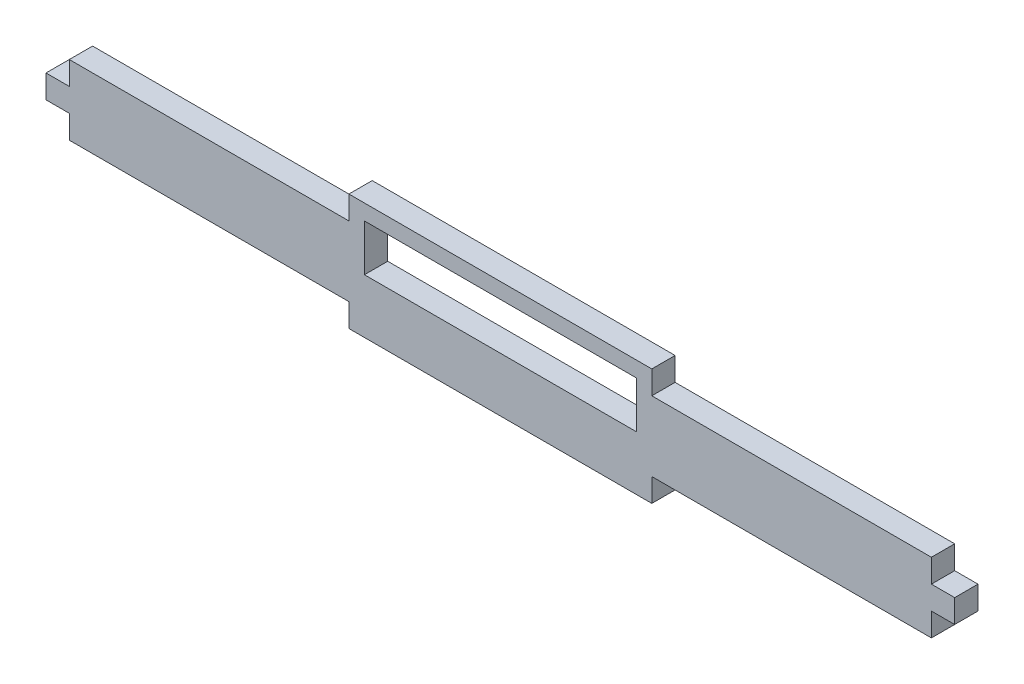
ISO-10303-21;
HEADER;
FILE_DESCRIPTION(('STEP AP214'),'2;1');
FILE_NAME('part.step','',(''),(''),'','','');
FILE_SCHEMA(('AUTOMOTIVE_DESIGN { 1 0 10303 214 1 1 1 1 }'));
ENDSEC;
DATA;
#1=APPLICATION_CONTEXT('core data for automotive mechanical design processes');
#2=APPLICATION_PROTOCOL_DEFINITION('international standard','automotive_design',2000,#1);
#3=PRODUCT_CONTEXT('',#1,'mechanical');
#4=PRODUCT('Part','Part','',(#3));
#5=PRODUCT_RELATED_PRODUCT_CATEGORY('part','',(#4));
#6=PRODUCT_DEFINITION_FORMATION('','',#4);
#7=PRODUCT_DEFINITION_CONTEXT('part definition',#1,'design');
#8=PRODUCT_DEFINITION('design','',#6,#7);
#9=PRODUCT_DEFINITION_SHAPE('','',#8);
#10=(LENGTH_UNIT() NAMED_UNIT(*) SI_UNIT(.MILLI.,.METRE.));
#11=(NAMED_UNIT(*) PLANE_ANGLE_UNIT() SI_UNIT($,.RADIAN.));
#12=(NAMED_UNIT(*) SI_UNIT($,.STERADIAN.) SOLID_ANGLE_UNIT());
#13=UNCERTAINTY_MEASURE_WITH_UNIT(LENGTH_MEASURE(1.E-05),#10,'distance_accuracy_value','');
#14=(GEOMETRIC_REPRESENTATION_CONTEXT(3) GLOBAL_UNCERTAINTY_ASSIGNED_CONTEXT((#13)) GLOBAL_UNIT_ASSIGNED_CONTEXT((#10,
#11,#12)) REPRESENTATION_CONTEXT('',''));
#15=CARTESIAN_POINT('',(0.,0.,0.));
#16=DIRECTION('',(0.,0.,1.));
#17=DIRECTION('',(1.,0.,0.));
#18=AXIS2_PLACEMENT_3D('',#15,#16,#17);
#19=CARTESIAN_POINT('',(0.,0.,3.));
#20=DIRECTION('',(0.,0.,1.));
#21=DIRECTION('',(1.,0.,0.));
#22=AXIS2_PLACEMENT_3D('',#19,#20,#21);
#23=PLANE('',#22);
#24=DIRECTION('',(0.,-1.,0.));
#25=VECTOR('',#24,1.);
#26=CARTESIAN_POINT('',(-19.5,-7.5,3.));
#27=LINE('',#26,#25);
#28=CARTESIAN_POINT('',(-19.5,-4.5,3.));
#29=VERTEX_POINT('',#28);
#30=CARTESIAN_POINT('',(-19.5,-7.5,3.));
#31=VERTEX_POINT('',#30);
#32=EDGE_CURVE('E230',#29,#31,#27,.T.);
#33=ORIENTED_EDGE('',*,*,#32,.T.);
#34=DIRECTION('',(1.,0.,0.));
#35=VECTOR('',#34,1.);
#36=CARTESIAN_POINT('',(-19.5,-7.5,3.));
#37=LINE('',#36,#35);
#38=CARTESIAN_POINT('',(19.5,-7.5,3.));
#39=VERTEX_POINT('',#38);
#40=EDGE_CURVE('E233',#31,#39,#37,.T.);
#41=ORIENTED_EDGE('',*,*,#40,.T.);
#42=DIRECTION('',(0.,1.,0.));
#43=VECTOR('',#42,1.);
#44=CARTESIAN_POINT('',(19.5,-4.5,3.));
#45=LINE('',#44,#43);
#46=CARTESIAN_POINT('',(19.5,-4.5,3.));
#47=VERTEX_POINT('',#46);
#48=EDGE_CURVE('E236',#39,#47,#45,.T.);
#49=ORIENTED_EDGE('',*,*,#48,.T.);
#50=DIRECTION('',(1.,0.,0.));
#51=VECTOR('',#50,1.);
#52=CARTESIAN_POINT('',(55.5,-4.5,3.));
#53=LINE('',#52,#51);
#54=CARTESIAN_POINT('',(55.5,-4.5,3.));
#55=VERTEX_POINT('',#54);
#56=EDGE_CURVE('E238',#47,#55,#53,.T.);
#57=ORIENTED_EDGE('',*,*,#56,.T.);
#58=DIRECTION('',(0.,1.,0.));
#59=VECTOR('',#58,1.);
#60=CARTESIAN_POINT('',(55.5,-1.5,3.));
#61=LINE('',#60,#59);
#62=CARTESIAN_POINT('',(55.5,-1.5,3.));
#63=VERTEX_POINT('',#62);
#64=EDGE_CURVE('E240',#55,#63,#61,.T.);
#65=ORIENTED_EDGE('',*,*,#64,.T.);
#66=DIRECTION('',(1.,0.,0.));
#67=VECTOR('',#66,1.);
#68=CARTESIAN_POINT('',(58.5,-1.50000000000002,3.));
#69=LINE('',#68,#67);
#70=CARTESIAN_POINT('',(58.5,-1.50000000000002,3.));
#71=VERTEX_POINT('',#70);
#72=EDGE_CURVE('E242',#63,#71,#69,.T.);
#73=ORIENTED_EDGE('',*,*,#72,.T.);
#74=DIRECTION('',(0.,1.,0.));
#75=VECTOR('',#74,1.);
#76=CARTESIAN_POINT('',(58.5,-1.50000000000002,3.));
#77=LINE('',#76,#75);
#78=CARTESIAN_POINT('',(58.5,1.49999999999998,3.));
#79=VERTEX_POINT('',#78);
#80=EDGE_CURVE('E244',#71,#79,#77,.T.);
#81=ORIENTED_EDGE('',*,*,#80,.T.);
#82=DIRECTION('',(-1.,0.,0.));
#83=VECTOR('',#82,1.);
#84=CARTESIAN_POINT('',(58.5,1.49999999999998,3.));
#85=LINE('',#84,#83);
#86=CARTESIAN_POINT('',(55.5,1.5,3.));
#87=VERTEX_POINT('',#86);
#88=EDGE_CURVE('E246',#79,#87,#85,.T.);
#89=ORIENTED_EDGE('',*,*,#88,.T.);
#90=DIRECTION('',(0.,1.,0.));
#91=VECTOR('',#90,1.);
#92=CARTESIAN_POINT('',(55.5,1.5,3.));
#93=LINE('',#92,#91);
#94=CARTESIAN_POINT('',(55.5,4.5,3.));
#95=VERTEX_POINT('',#94);
#96=EDGE_CURVE('E248',#87,#95,#93,.T.);
#97=ORIENTED_EDGE('',*,*,#96,.T.);
#98=DIRECTION('',(-1.,0.,0.));
#99=VECTOR('',#98,1.);
#100=CARTESIAN_POINT('',(19.5,4.5,3.));
#101=LINE('',#100,#99);
#102=CARTESIAN_POINT('',(19.5,4.5,3.));
#103=VERTEX_POINT('',#102);
#104=EDGE_CURVE('E250',#95,#103,#101,.T.);
#105=ORIENTED_EDGE('',*,*,#104,.T.);
#106=DIRECTION('',(0.,1.,0.));
#107=VECTOR('',#106,1.);
#108=CARTESIAN_POINT('',(19.5,7.5,3.));
#109=LINE('',#108,#107);
#110=CARTESIAN_POINT('',(19.5,7.5,3.));
#111=VERTEX_POINT('',#110);
#112=EDGE_CURVE('E252',#103,#111,#109,.T.);
#113=ORIENTED_EDGE('',*,*,#112,.T.);
#114=DIRECTION('',(-1.,0.,0.));
#115=VECTOR('',#114,1.);
#116=CARTESIAN_POINT('',(19.5,7.5,3.));
#117=LINE('',#116,#115);
#118=CARTESIAN_POINT('',(-19.5,7.5,3.));
#119=VERTEX_POINT('',#118);
#120=EDGE_CURVE('E254',#111,#119,#117,.T.);
#121=ORIENTED_EDGE('',*,*,#120,.T.);
#122=DIRECTION('',(0.,-1.,0.));
#123=VECTOR('',#122,1.);
#124=CARTESIAN_POINT('',(-19.5,7.5,3.));
#125=LINE('',#124,#123);
#126=CARTESIAN_POINT('',(-19.5,4.5,3.));
#127=VERTEX_POINT('',#126);
#128=EDGE_CURVE('E256',#119,#127,#125,.T.);
#129=ORIENTED_EDGE('',*,*,#128,.T.);
#130=DIRECTION('',(-1.,0.,0.));
#131=VECTOR('',#130,1.);
#132=CARTESIAN_POINT('',(-55.5,4.5,3.));
#133=LINE('',#132,#131);
#134=CARTESIAN_POINT('',(-55.5,4.5,3.));
#135=VERTEX_POINT('',#134);
#136=EDGE_CURVE('E258',#127,#135,#133,.T.);
#137=ORIENTED_EDGE('',*,*,#136,.T.);
#138=DIRECTION('',(0.,-1.,0.));
#139=VECTOR('',#138,1.);
#140=CARTESIAN_POINT('',(-55.5,1.49999999999998,3.));
#141=LINE('',#140,#139);
#142=CARTESIAN_POINT('',(-55.5,1.49999999999998,3.));
#143=VERTEX_POINT('',#142);
#144=EDGE_CURVE('E260',#135,#143,#141,.T.);
#145=ORIENTED_EDGE('',*,*,#144,.T.);
#146=DIRECTION('',(-1.,0.,0.));
#147=VECTOR('',#146,1.);
#148=CARTESIAN_POINT('',(-58.5,1.49999999999999,3.));
#149=LINE('',#148,#147);
#150=CARTESIAN_POINT('',(-58.5,1.49999999999999,3.));
#151=VERTEX_POINT('',#150);
#152=EDGE_CURVE('E262',#143,#151,#149,.T.);
#153=ORIENTED_EDGE('',*,*,#152,.T.);
#154=DIRECTION('',(0.,-1.,0.));
#155=VECTOR('',#154,1.);
#156=CARTESIAN_POINT('',(-58.5,1.49999999999999,3.));
#157=LINE('',#156,#155);
#158=CARTESIAN_POINT('',(-58.5,-1.5,3.));
#159=VERTEX_POINT('',#158);
#160=EDGE_CURVE('E264',#151,#159,#157,.T.);
#161=ORIENTED_EDGE('',*,*,#160,.T.);
#162=DIRECTION('',(1.,0.,0.));
#163=VECTOR('',#162,1.);
#164=CARTESIAN_POINT('',(-58.5,-1.5,3.));
#165=LINE('',#164,#163);
#166=CARTESIAN_POINT('',(-55.5,-1.50000000000002,3.));
#167=VERTEX_POINT('',#166);
#168=EDGE_CURVE('E266',#159,#167,#165,.T.);
#169=ORIENTED_EDGE('',*,*,#168,.T.);
#170=DIRECTION('',(0.,-1.,0.));
#171=VECTOR('',#170,1.);
#172=CARTESIAN_POINT('',(-55.5,-1.50000000000002,3.));
#173=LINE('',#172,#171);
#174=CARTESIAN_POINT('',(-55.5,-4.5,3.));
#175=VERTEX_POINT('',#174);
#176=EDGE_CURVE('E268',#167,#175,#173,.T.);
#177=ORIENTED_EDGE('',*,*,#176,.T.);
#178=DIRECTION('',(1.,0.,0.));
#179=VECTOR('',#178,1.);
#180=CARTESIAN_POINT('',(-19.5,-4.5,3.));
#181=LINE('',#180,#179);
#182=EDGE_CURVE('E270',#175,#29,#181,.T.);
#183=ORIENTED_EDGE('',*,*,#182,.T.);
#184=EDGE_LOOP('',(#33,#41,#49,#57,#65,#73,#81,#89,#97,#105,#113,#121,#129,#137,#145,#153,#161,
#169,#177,#183));
#185=FACE_BOUND('',#184,.T.);
#186=DIRECTION('',(-1.,0.,0.));
#187=VECTOR('',#186,1.);
#188=CARTESIAN_POINT('',(-17.5,5.5,3.));
#189=LINE('',#188,#187);
#190=CARTESIAN_POINT('',(17.5,5.5,3.));
#191=VERTEX_POINT('',#190);
#192=CARTESIAN_POINT('',(-17.5,5.5,3.));
#193=VERTEX_POINT('',#192);
#194=EDGE_CURVE('E202',#191,#193,#189,.T.);
#195=ORIENTED_EDGE('',*,*,#194,.F.);
#196=DIRECTION('',(0.,1.,0.));
#197=VECTOR('',#196,1.);
#198=CARTESIAN_POINT('',(17.5,-0.5,3.));
#199=LINE('',#198,#197);
#200=CARTESIAN_POINT('',(17.5,-0.5,3.));
#201=VERTEX_POINT('',#200);
#202=EDGE_CURVE('E194',#201,#191,#199,.T.);
#203=ORIENTED_EDGE('',*,*,#202,.F.);
#204=DIRECTION('',(1.,0.,0.));
#205=VECTOR('',#204,1.);
#206=CARTESIAN_POINT('',(-17.5,-0.5,3.));
#207=LINE('',#206,#205);
#208=CARTESIAN_POINT('',(-17.5,-0.5,3.));
#209=VERTEX_POINT('',#208);
#210=EDGE_CURVE('E216',#209,#201,#207,.T.);
#211=ORIENTED_EDGE('',*,*,#210,.F.);
#212=DIRECTION('',(0.,-1.,0.));
#213=VECTOR('',#212,1.);
#214=CARTESIAN_POINT('',(-17.5,-0.5,3.));
#215=LINE('',#214,#213);
#216=EDGE_CURVE('E214',#193,#209,#215,.T.);
#217=ORIENTED_EDGE('',*,*,#216,.F.);
#218=EDGE_LOOP('',(#195,#203,#211,#217));
#219=FACE_BOUND('',#218,.T.);
#220=ADVANCED_FACE('F33',(#185,#219),#23,.T.);
#221=CARTESIAN_POINT('',(0.,0.,0.));
#222=DIRECTION('',(0.,0.,1.));
#223=DIRECTION('',(1.,0.,0.));
#224=AXIS2_PLACEMENT_3D('',#221,#222,#223);
#225=PLANE('',#224);
#226=DIRECTION('',(0.,-1.,0.));
#227=VECTOR('',#226,1.);
#228=CARTESIAN_POINT('',(-19.5,-7.5,0.));
#229=LINE('',#228,#227);
#230=CARTESIAN_POINT('',(-19.5,-4.5,0.));
#231=VERTEX_POINT('',#230);
#232=CARTESIAN_POINT('',(-19.5,-7.5,0.));
#233=VERTEX_POINT('',#232);
#234=EDGE_CURVE('E210',#231,#233,#229,.T.);
#235=ORIENTED_EDGE('',*,*,#234,.F.);
#236=DIRECTION('',(1.,0.,0.));
#237=VECTOR('',#236,1.);
#238=CARTESIAN_POINT('',(-19.5,-4.5,0.));
#239=LINE('',#238,#237);
#240=CARTESIAN_POINT('',(-55.5,-4.5,0.));
#241=VERTEX_POINT('',#240);
#242=EDGE_CURVE('E234',#241,#231,#239,.T.);
#243=ORIENTED_EDGE('',*,*,#242,.F.);
#244=DIRECTION('',(0.,-1.,0.));
#245=VECTOR('',#244,1.);
#246=CARTESIAN_POINT('',(-55.5,-1.50000000000002,0.));
#247=LINE('',#246,#245);
#248=CARTESIAN_POINT('',(-55.5,-1.50000000000002,0.));
#249=VERTEX_POINT('',#248);
#250=EDGE_CURVE('E309',#249,#241,#247,.T.);
#251=ORIENTED_EDGE('',*,*,#250,.F.);
#252=DIRECTION('',(1.,0.,0.));
#253=VECTOR('',#252,1.);
#254=CARTESIAN_POINT('',(-58.5,-1.5,0.));
#255=LINE('',#254,#253);
#256=CARTESIAN_POINT('',(-58.5,-1.5,0.));
#257=VERTEX_POINT('',#256);
#258=EDGE_CURVE('E307',#257,#249,#255,.T.);
#259=ORIENTED_EDGE('',*,*,#258,.F.);
#260=DIRECTION('',(0.,-1.,0.));
#261=VECTOR('',#260,1.);
#262=CARTESIAN_POINT('',(-58.5,1.49999999999999,0.));
#263=LINE('',#262,#261);
#264=CARTESIAN_POINT('',(-58.5,1.49999999999999,0.));
#265=VERTEX_POINT('',#264);
#266=EDGE_CURVE('E305',#265,#257,#263,.T.);
#267=ORIENTED_EDGE('',*,*,#266,.F.);
#268=DIRECTION('',(-1.,0.,0.));
#269=VECTOR('',#268,1.);
#270=CARTESIAN_POINT('',(-58.5,1.49999999999999,0.));
#271=LINE('',#270,#269);
#272=CARTESIAN_POINT('',(-55.5,1.49999999999998,0.));
#273=VERTEX_POINT('',#272);
#274=EDGE_CURVE('E303',#273,#265,#271,.T.);
#275=ORIENTED_EDGE('',*,*,#274,.F.);
#276=DIRECTION('',(0.,-1.,0.));
#277=VECTOR('',#276,1.);
#278=CARTESIAN_POINT('',(-55.5,1.49999999999998,0.));
#279=LINE('',#278,#277);
#280=CARTESIAN_POINT('',(-55.5,4.5,0.));
#281=VERTEX_POINT('',#280);
#282=EDGE_CURVE('E301',#281,#273,#279,.T.);
#283=ORIENTED_EDGE('',*,*,#282,.F.);
#284=DIRECTION('',(-1.,0.,0.));
#285=VECTOR('',#284,1.);
#286=CARTESIAN_POINT('',(-55.5,4.5,0.));
#287=LINE('',#286,#285);
#288=CARTESIAN_POINT('',(-19.5,4.5,0.));
#289=VERTEX_POINT('',#288);
#290=EDGE_CURVE('E299',#289,#281,#287,.T.);
#291=ORIENTED_EDGE('',*,*,#290,.F.);
#292=DIRECTION('',(0.,-1.,0.));
#293=VECTOR('',#292,1.);
#294=CARTESIAN_POINT('',(-19.5,7.5,0.));
#295=LINE('',#294,#293);
#296=CARTESIAN_POINT('',(-19.5,7.5,0.));
#297=VERTEX_POINT('',#296);
#298=EDGE_CURVE('E297',#297,#289,#295,.T.);
#299=ORIENTED_EDGE('',*,*,#298,.F.);
#300=DIRECTION('',(-1.,0.,0.));
#301=VECTOR('',#300,1.);
#302=CARTESIAN_POINT('',(19.5,7.5,0.));
#303=LINE('',#302,#301);
#304=CARTESIAN_POINT('',(19.5,7.5,0.));
#305=VERTEX_POINT('',#304);
#306=EDGE_CURVE('E295',#305,#297,#303,.T.);
#307=ORIENTED_EDGE('',*,*,#306,.F.);
#308=DIRECTION('',(0.,1.,0.));
#309=VECTOR('',#308,1.);
#310=CARTESIAN_POINT('',(19.5,7.5,0.));
#311=LINE('',#310,#309);
#312=CARTESIAN_POINT('',(19.5,4.5,0.));
#313=VERTEX_POINT('',#312);
#314=EDGE_CURVE('E293',#313,#305,#311,.T.);
#315=ORIENTED_EDGE('',*,*,#314,.F.);
#316=DIRECTION('',(-1.,0.,0.));
#317=VECTOR('',#316,1.);
#318=CARTESIAN_POINT('',(19.5,4.5,0.));
#319=LINE('',#318,#317);
#320=CARTESIAN_POINT('',(55.5,4.5,0.));
#321=VERTEX_POINT('',#320);
#322=EDGE_CURVE('E291',#321,#313,#319,.T.);
#323=ORIENTED_EDGE('',*,*,#322,.F.);
#324=DIRECTION('',(0.,1.,0.));
#325=VECTOR('',#324,1.);
#326=CARTESIAN_POINT('',(55.5,1.5,0.));
#327=LINE('',#326,#325);
#328=CARTESIAN_POINT('',(55.5,1.5,0.));
#329=VERTEX_POINT('',#328);
#330=EDGE_CURVE('E289',#329,#321,#327,.T.);
#331=ORIENTED_EDGE('',*,*,#330,.F.);
#332=DIRECTION('',(-1.,0.,0.));
#333=VECTOR('',#332,1.);
#334=CARTESIAN_POINT('',(58.5,1.49999999999998,0.));
#335=LINE('',#334,#333);
#336=CARTESIAN_POINT('',(58.5,1.49999999999998,0.));
#337=VERTEX_POINT('',#336);
#338=EDGE_CURVE('E287',#337,#329,#335,.T.);
#339=ORIENTED_EDGE('',*,*,#338,.F.);
#340=DIRECTION('',(0.,1.,0.));
#341=VECTOR('',#340,1.);
#342=CARTESIAN_POINT('',(58.5,-1.50000000000002,0.));
#343=LINE('',#342,#341);
#344=CARTESIAN_POINT('',(58.5,-1.50000000000002,0.));
#345=VERTEX_POINT('',#344);
#346=EDGE_CURVE('E285',#345,#337,#343,.T.);
#347=ORIENTED_EDGE('',*,*,#346,.F.);
#348=DIRECTION('',(1.,0.,0.));
#349=VECTOR('',#348,1.);
#350=CARTESIAN_POINT('',(58.5,-1.50000000000002,0.));
#351=LINE('',#350,#349);
#352=CARTESIAN_POINT('',(55.5,-1.5,0.));
#353=VERTEX_POINT('',#352);
#354=EDGE_CURVE('E283',#353,#345,#351,.T.);
#355=ORIENTED_EDGE('',*,*,#354,.F.);
#356=DIRECTION('',(0.,1.,0.));
#357=VECTOR('',#356,1.);
#358=CARTESIAN_POINT('',(55.5,-1.5,0.));
#359=LINE('',#358,#357);
#360=CARTESIAN_POINT('',(55.5,-4.5,0.));
#361=VERTEX_POINT('',#360);
#362=EDGE_CURVE('E281',#361,#353,#359,.T.);
#363=ORIENTED_EDGE('',*,*,#362,.F.);
#364=DIRECTION('',(1.,0.,0.));
#365=VECTOR('',#364,1.);
#366=CARTESIAN_POINT('',(55.5,-4.5,0.));
#367=LINE('',#366,#365);
#368=CARTESIAN_POINT('',(19.5,-4.5,0.));
#369=VERTEX_POINT('',#368);
#370=EDGE_CURVE('E279',#369,#361,#367,.T.);
#371=ORIENTED_EDGE('',*,*,#370,.F.);
#372=DIRECTION('',(0.,1.,0.));
#373=VECTOR('',#372,1.);
#374=CARTESIAN_POINT('',(19.5,-4.5,0.));
#375=LINE('',#374,#373);
#376=CARTESIAN_POINT('',(19.5,-7.5,0.));
#377=VERTEX_POINT('',#376);
#378=EDGE_CURVE('E277',#377,#369,#375,.T.);
#379=ORIENTED_EDGE('',*,*,#378,.F.);
#380=DIRECTION('',(1.,0.,0.));
#381=VECTOR('',#380,1.);
#382=CARTESIAN_POINT('',(-19.5,-7.5,0.));
#383=LINE('',#382,#381);
#384=EDGE_CURVE('E275',#233,#377,#383,.T.);
#385=ORIENTED_EDGE('',*,*,#384,.F.);
#386=EDGE_LOOP('',(#235,#243,#251,#259,#267,#275,#283,#291,#299,#307,#315,#323,#331,#339,#347,
#355,#363,#371,#379,#385));
#387=FACE_BOUND('',#386,.T.);
#388=DIRECTION('',(0.,1.,0.));
#389=VECTOR('',#388,1.);
#390=CARTESIAN_POINT('',(17.5,-0.5,0.));
#391=LINE('',#390,#389);
#392=CARTESIAN_POINT('',(17.5,-0.5,0.));
#393=VERTEX_POINT('',#392);
#394=CARTESIAN_POINT('',(17.5,5.5,0.));
#395=VERTEX_POINT('',#394);
#396=EDGE_CURVE('E56',#393,#395,#391,.T.);
#397=ORIENTED_EDGE('',*,*,#396,.T.);
#398=DIRECTION('',(-1.,0.,0.));
#399=VECTOR('',#398,1.);
#400=CARTESIAN_POINT('',(-17.5,5.5,0.));
#401=LINE('',#400,#399);
#402=CARTESIAN_POINT('',(-17.5,5.5,0.));
#403=VERTEX_POINT('',#402);
#404=EDGE_CURVE('E209',#395,#403,#401,.T.);
#405=ORIENTED_EDGE('',*,*,#404,.T.);
#406=DIRECTION('',(0.,-1.,0.));
#407=VECTOR('',#406,1.);
#408=CARTESIAN_POINT('',(-17.5,-0.5,0.));
#409=LINE('',#408,#407);
#410=CARTESIAN_POINT('',(-17.5,-0.5,0.));
#411=VERTEX_POINT('',#410);
#412=EDGE_CURVE('E222',#403,#411,#409,.T.);
#413=ORIENTED_EDGE('',*,*,#412,.T.);
#414=DIRECTION('',(1.,0.,0.));
#415=VECTOR('',#414,1.);
#416=CARTESIAN_POINT('',(-17.5,-0.5,0.));
#417=LINE('',#416,#415);
#418=EDGE_CURVE('E203',#411,#393,#417,.T.);
#419=ORIENTED_EDGE('',*,*,#418,.T.);
#420=EDGE_LOOP('',(#397,#405,#413,#419));
#421=FACE_BOUND('',#420,.T.);
#422=ADVANCED_FACE('F375',(#387,#421),#225,.F.);
#423=CARTESIAN_POINT('',(-19.5,-7.5,3.));
#424=DIRECTION('',(1.,0.,0.));
#425=DIRECTION('',(0.,1.,0.));
#426=AXIS2_PLACEMENT_3D('',#423,#424,#425);
#427=PLANE('',#426);
#428=ORIENTED_EDGE('',*,*,#234,.T.);
#429=DIRECTION('',(0.,0.,-1.));
#430=VECTOR('',#429,1.);
#431=CARTESIAN_POINT('',(-19.5,-7.5,3.));
#432=LINE('',#431,#430);
#433=EDGE_CURVE('E11',#31,#233,#432,.T.);
#434=ORIENTED_EDGE('',*,*,#433,.F.);
#435=ORIENTED_EDGE('',*,*,#32,.F.);
#436=DIRECTION('',(0.,0.,-1.));
#437=VECTOR('',#436,1.);
#438=CARTESIAN_POINT('',(-19.5,-4.5,3.));
#439=LINE('',#438,#437);
#440=EDGE_CURVE('E272',#29,#231,#439,.T.);
#441=ORIENTED_EDGE('',*,*,#440,.T.);
#442=EDGE_LOOP('',(#428,#434,#435,#441));
#443=FACE_BOUND('',#442,.T.);
#444=ADVANCED_FACE('F35',(#443),#427,.F.);
#445=CARTESIAN_POINT('',(-19.5,-7.5,3.));
#446=DIRECTION('',(0.,1.,0.));
#447=DIRECTION('',(0.,0.,1.));
#448=AXIS2_PLACEMENT_3D('',#445,#446,#447);
#449=PLANE('',#448);
#450=ORIENTED_EDGE('',*,*,#384,.T.);
#451=DIRECTION('',(0.,0.,-1.));
#452=VECTOR('',#451,1.);
#453=CARTESIAN_POINT('',(19.5,-7.5,3.));
#454=LINE('',#453,#452);
#455=EDGE_CURVE('E41',#39,#377,#454,.T.);
#456=ORIENTED_EDGE('',*,*,#455,.F.);
#457=ORIENTED_EDGE('',*,*,#40,.F.);
#458=ORIENTED_EDGE('',*,*,#433,.T.);
#459=EDGE_LOOP('',(#450,#456,#457,#458));
#460=FACE_BOUND('',#459,.T.);
#461=ADVANCED_FACE('F392',(#460),#449,.F.);
#462=CARTESIAN_POINT('',(19.5,-4.5,3.));
#463=DIRECTION('',(-1.,0.,0.));
#464=DIRECTION('',(0.,-1.,0.));
#465=AXIS2_PLACEMENT_3D('',#462,#463,#464);
#466=PLANE('',#465);
#467=ORIENTED_EDGE('',*,*,#378,.T.);
#468=DIRECTION('',(0.,0.,-1.));
#469=VECTOR('',#468,1.);
#470=CARTESIAN_POINT('',(19.5,-4.5,3.));
#471=LINE('',#470,#469);
#472=EDGE_CURVE('E362',#47,#369,#471,.T.);
#473=ORIENTED_EDGE('',*,*,#472,.F.);
#474=ORIENTED_EDGE('',*,*,#48,.F.);
#475=ORIENTED_EDGE('',*,*,#455,.T.);
#476=EDGE_LOOP('',(#467,#473,#474,#475));
#477=FACE_BOUND('',#476,.T.);
#478=ADVANCED_FACE('F369',(#477),#466,.F.);
#479=CARTESIAN_POINT('',(55.5,-4.5,3.));
#480=DIRECTION('',(0.,1.,0.));
#481=DIRECTION('',(0.,0.,1.));
#482=AXIS2_PLACEMENT_3D('',#479,#480,#481);
#483=PLANE('',#482);
#484=ORIENTED_EDGE('',*,*,#370,.T.);
#485=DIRECTION('',(0.,0.,-1.));
#486=VECTOR('',#485,1.);
#487=CARTESIAN_POINT('',(55.5,-4.5,3.));
#488=LINE('',#487,#486);
#489=EDGE_CURVE('E359',#55,#361,#488,.T.);
#490=ORIENTED_EDGE('',*,*,#489,.F.);
#491=ORIENTED_EDGE('',*,*,#56,.F.);
#492=ORIENTED_EDGE('',*,*,#472,.T.);
#493=EDGE_LOOP('',(#484,#490,#491,#492));
#494=FACE_BOUND('',#493,.T.);
#495=ADVANCED_FACE('F381',(#494),#483,.F.);
#496=CARTESIAN_POINT('',(55.5,-1.5,3.));
#497=DIRECTION('',(-1.,0.,0.));
#498=DIRECTION('',(0.,0.,1.));
#499=AXIS2_PLACEMENT_3D('',#496,#497,#498);
#500=PLANE('',#499);
#501=ORIENTED_EDGE('',*,*,#362,.T.);
#502=DIRECTION('',(0.,0.,-1.));
#503=VECTOR('',#502,1.);
#504=CARTESIAN_POINT('',(55.5,-1.5,3.));
#505=LINE('',#504,#503);
#506=EDGE_CURVE('E356',#63,#353,#505,.T.);
#507=ORIENTED_EDGE('',*,*,#506,.F.);
#508=ORIENTED_EDGE('',*,*,#64,.F.);
#509=ORIENTED_EDGE('',*,*,#489,.T.);
#510=EDGE_LOOP('',(#501,#507,#508,#509));
#511=FACE_BOUND('',#510,.T.);
#512=ADVANCED_FACE('F385',(#511),#500,.F.);
#513=CARTESIAN_POINT('',(58.5,-1.50000000000002,3.));
#514=DIRECTION('',(0.,1.,0.));
#515=DIRECTION('',(-1.,0.,0.));
#516=AXIS2_PLACEMENT_3D('',#513,#514,#515);
#517=PLANE('',#516);
#518=ORIENTED_EDGE('',*,*,#354,.T.);
#519=DIRECTION('',(0.,0.,-1.));
#520=VECTOR('',#519,1.);
#521=CARTESIAN_POINT('',(58.5,-1.50000000000002,3.));
#522=LINE('',#521,#520);
#523=EDGE_CURVE('E353',#71,#345,#522,.T.);
#524=ORIENTED_EDGE('',*,*,#523,.F.);
#525=ORIENTED_EDGE('',*,*,#72,.F.);
#526=ORIENTED_EDGE('',*,*,#506,.T.);
#527=EDGE_LOOP('',(#518,#524,#525,#526));
#528=FACE_BOUND('',#527,.T.);
#529=ADVANCED_FACE('F465',(#528),#517,.F.);
#530=CARTESIAN_POINT('',(58.5,-1.50000000000002,3.));
#531=DIRECTION('',(-1.,0.,0.));
#532=DIRECTION('',(0.,-1.,0.));
#533=AXIS2_PLACEMENT_3D('',#530,#531,#532);
#534=PLANE('',#533);
#535=ORIENTED_EDGE('',*,*,#346,.T.);
#536=DIRECTION('',(0.,0.,-1.));
#537=VECTOR('',#536,1.);
#538=CARTESIAN_POINT('',(58.5,1.49999999999998,3.));
#539=LINE('',#538,#537);
#540=EDGE_CURVE('E350',#79,#337,#539,.T.);
#541=ORIENTED_EDGE('',*,*,#540,.F.);
#542=ORIENTED_EDGE('',*,*,#80,.F.);
#543=ORIENTED_EDGE('',*,*,#523,.T.);
#544=EDGE_LOOP('',(#535,#541,#542,#543));
#545=FACE_BOUND('',#544,.T.);
#546=ADVANCED_FACE('F463',(#545),#534,.F.);
#547=CARTESIAN_POINT('',(58.5,1.49999999999998,3.));
#548=DIRECTION('',(0.,-1.,0.));
#549=DIRECTION('',(1.,0.,0.));
#550=AXIS2_PLACEMENT_3D('',#547,#548,#549);
#551=PLANE('',#550);
#552=ORIENTED_EDGE('',*,*,#338,.T.);
#553=DIRECTION('',(0.,0.,-1.));
#554=VECTOR('',#553,1.);
#555=CARTESIAN_POINT('',(55.5,1.5,3.));
#556=LINE('',#555,#554);
#557=EDGE_CURVE('E347',#87,#329,#556,.T.);
#558=ORIENTED_EDGE('',*,*,#557,.F.);
#559=ORIENTED_EDGE('',*,*,#88,.F.);
#560=ORIENTED_EDGE('',*,*,#540,.T.);
#561=EDGE_LOOP('',(#552,#558,#559,#560));
#562=FACE_BOUND('',#561,.T.);
#563=ADVANCED_FACE('F458',(#562),#551,.F.);
#564=CARTESIAN_POINT('',(55.5,1.5,3.));
#565=DIRECTION('',(-1.,0.,0.));
#566=DIRECTION('',(0.,0.,1.));
#567=AXIS2_PLACEMENT_3D('',#564,#565,#566);
#568=PLANE('',#567);
#569=ORIENTED_EDGE('',*,*,#330,.T.);
#570=DIRECTION('',(0.,0.,-1.));
#571=VECTOR('',#570,1.);
#572=CARTESIAN_POINT('',(55.5,4.5,3.));
#573=LINE('',#572,#571);
#574=EDGE_CURVE('E344',#95,#321,#573,.T.);
#575=ORIENTED_EDGE('',*,*,#574,.F.);
#576=ORIENTED_EDGE('',*,*,#96,.F.);
#577=ORIENTED_EDGE('',*,*,#557,.T.);
#578=EDGE_LOOP('',(#569,#575,#576,#577));
#579=FACE_BOUND('',#578,.T.);
#580=ADVANCED_FACE('F453',(#579),#568,.F.);
#581=CARTESIAN_POINT('',(19.5,4.5,3.));
#582=DIRECTION('',(0.,-1.,0.));
#583=DIRECTION('',(0.,0.,-1.));
#584=AXIS2_PLACEMENT_3D('',#581,#582,#583);
#585=PLANE('',#584);
#586=ORIENTED_EDGE('',*,*,#322,.T.);
#587=DIRECTION('',(0.,0.,-1.));
#588=VECTOR('',#587,1.);
#589=CARTESIAN_POINT('',(19.5,4.5,3.));
#590=LINE('',#589,#588);
#591=EDGE_CURVE('E341',#103,#313,#590,.T.);
#592=ORIENTED_EDGE('',*,*,#591,.F.);
#593=ORIENTED_EDGE('',*,*,#104,.F.);
#594=ORIENTED_EDGE('',*,*,#574,.T.);
#595=EDGE_LOOP('',(#586,#592,#593,#594));
#596=FACE_BOUND('',#595,.T.);
#597=ADVANCED_FACE('F449',(#596),#585,.F.);
#598=CARTESIAN_POINT('',(19.5,7.5,3.));
#599=DIRECTION('',(-1.,0.,0.));
#600=DIRECTION('',(0.,-1.,0.));
#601=AXIS2_PLACEMENT_3D('',#598,#599,#600);
#602=PLANE('',#601);
#603=ORIENTED_EDGE('',*,*,#314,.T.);
#604=DIRECTION('',(0.,0.,-1.));
#605=VECTOR('',#604,1.);
#606=CARTESIAN_POINT('',(19.5,7.5,3.));
#607=LINE('',#606,#605);
#608=EDGE_CURVE('E338',#111,#305,#607,.T.);
#609=ORIENTED_EDGE('',*,*,#608,.F.);
#610=ORIENTED_EDGE('',*,*,#112,.F.);
#611=ORIENTED_EDGE('',*,*,#591,.T.);
#612=EDGE_LOOP('',(#603,#609,#610,#611));
#613=FACE_BOUND('',#612,.T.);
#614=ADVANCED_FACE('F444',(#613),#602,.F.);
#615=CARTESIAN_POINT('',(19.5,7.5,3.));
#616=DIRECTION('',(0.,-1.,0.));
#617=DIRECTION('',(0.,0.,-1.));
#618=AXIS2_PLACEMENT_3D('',#615,#616,#617);
#619=PLANE('',#618);
#620=ORIENTED_EDGE('',*,*,#306,.T.);
#621=DIRECTION('',(0.,0.,-1.));
#622=VECTOR('',#621,1.);
#623=CARTESIAN_POINT('',(-19.5,7.5,3.));
#624=LINE('',#623,#622);
#625=EDGE_CURVE('E335',#119,#297,#624,.T.);
#626=ORIENTED_EDGE('',*,*,#625,.F.);
#627=ORIENTED_EDGE('',*,*,#120,.F.);
#628=ORIENTED_EDGE('',*,*,#608,.T.);
#629=EDGE_LOOP('',(#620,#626,#627,#628));
#630=FACE_BOUND('',#629,.T.);
#631=ADVANCED_FACE('F438',(#630),#619,.F.);
#632=CARTESIAN_POINT('',(-19.5,7.5,3.));
#633=DIRECTION('',(1.,0.,0.));
#634=DIRECTION('',(0.,0.,-1.));
#635=AXIS2_PLACEMENT_3D('',#632,#633,#634);
#636=PLANE('',#635);
#637=ORIENTED_EDGE('',*,*,#298,.T.);
#638=DIRECTION('',(0.,0.,-1.));
#639=VECTOR('',#638,1.);
#640=CARTESIAN_POINT('',(-19.5,4.5,3.));
#641=LINE('',#640,#639);
#642=EDGE_CURVE('E332',#127,#289,#641,.T.);
#643=ORIENTED_EDGE('',*,*,#642,.F.);
#644=ORIENTED_EDGE('',*,*,#128,.F.);
#645=ORIENTED_EDGE('',*,*,#625,.T.);
#646=EDGE_LOOP('',(#637,#643,#644,#645));
#647=FACE_BOUND('',#646,.T.);
#648=ADVANCED_FACE('F434',(#647),#636,.F.);
#649=CARTESIAN_POINT('',(-55.5,4.5,3.));
#650=DIRECTION('',(0.,-1.,0.));
#651=DIRECTION('',(0.,0.,-1.));
#652=AXIS2_PLACEMENT_3D('',#649,#650,#651);
#653=PLANE('',#652);
#654=ORIENTED_EDGE('',*,*,#290,.T.);
#655=DIRECTION('',(0.,0.,-1.));
#656=VECTOR('',#655,1.);
#657=CARTESIAN_POINT('',(-55.5,4.5,3.));
#658=LINE('',#657,#656);
#659=EDGE_CURVE('E329',#135,#281,#658,.T.);
#660=ORIENTED_EDGE('',*,*,#659,.F.);
#661=ORIENTED_EDGE('',*,*,#136,.F.);
#662=ORIENTED_EDGE('',*,*,#642,.T.);
#663=EDGE_LOOP('',(#654,#660,#661,#662));
#664=FACE_BOUND('',#663,.T.);
#665=ADVANCED_FACE('F429',(#664),#653,.F.);
#666=CARTESIAN_POINT('',(-55.5,1.49999999999998,3.));
#667=DIRECTION('',(1.,0.,0.));
#668=DIRECTION('',(0.,0.,-1.));
#669=AXIS2_PLACEMENT_3D('',#666,#667,#668);
#670=PLANE('',#669);
#671=ORIENTED_EDGE('',*,*,#282,.T.);
#672=DIRECTION('',(0.,0.,-1.));
#673=VECTOR('',#672,1.);
#674=CARTESIAN_POINT('',(-55.5,1.49999999999998,3.));
#675=LINE('',#674,#673);
#676=EDGE_CURVE('E326',#143,#273,#675,.T.);
#677=ORIENTED_EDGE('',*,*,#676,.F.);
#678=ORIENTED_EDGE('',*,*,#144,.F.);
#679=ORIENTED_EDGE('',*,*,#659,.T.);
#680=EDGE_LOOP('',(#671,#677,#678,#679));
#681=FACE_BOUND('',#680,.T.);
#682=ADVANCED_FACE('F423',(#681),#670,.F.);
#683=CARTESIAN_POINT('',(-58.5,1.49999999999999,3.));
#684=DIRECTION('',(0.,-1.,0.));
#685=DIRECTION('',(1.,0.,0.));
#686=AXIS2_PLACEMENT_3D('',#683,#684,#685);
#687=PLANE('',#686);
#688=ORIENTED_EDGE('',*,*,#274,.T.);
#689=DIRECTION('',(0.,0.,-1.));
#690=VECTOR('',#689,1.);
#691=CARTESIAN_POINT('',(-58.5,1.49999999999999,3.));
#692=LINE('',#691,#690);
#693=EDGE_CURVE('E323',#151,#265,#692,.T.);
#694=ORIENTED_EDGE('',*,*,#693,.F.);
#695=ORIENTED_EDGE('',*,*,#152,.F.);
#696=ORIENTED_EDGE('',*,*,#676,.T.);
#697=EDGE_LOOP('',(#688,#694,#695,#696));
#698=FACE_BOUND('',#697,.T.);
#699=ADVANCED_FACE('F419',(#698),#687,.F.);
#700=CARTESIAN_POINT('',(-58.5,1.49999999999999,3.));
#701=DIRECTION('',(1.,0.,0.));
#702=DIRECTION('',(0.,0.,-1.));
#703=AXIS2_PLACEMENT_3D('',#700,#701,#702);
#704=PLANE('',#703);
#705=ORIENTED_EDGE('',*,*,#266,.T.);
#706=DIRECTION('',(0.,0.,-1.));
#707=VECTOR('',#706,1.);
#708=CARTESIAN_POINT('',(-58.5,-1.5,3.));
#709=LINE('',#708,#707);
#710=EDGE_CURVE('E320',#159,#257,#709,.T.);
#711=ORIENTED_EDGE('',*,*,#710,.F.);
#712=ORIENTED_EDGE('',*,*,#160,.F.);
#713=ORIENTED_EDGE('',*,*,#693,.T.);
#714=EDGE_LOOP('',(#705,#711,#712,#713));
#715=FACE_BOUND('',#714,.T.);
#716=ADVANCED_FACE('F414',(#715),#704,.F.);
#717=CARTESIAN_POINT('',(-58.5,-1.5,3.));
#718=DIRECTION('',(0.,1.,0.));
#719=DIRECTION('',(-1.,0.,0.));
#720=AXIS2_PLACEMENT_3D('',#717,#718,#719);
#721=PLANE('',#720);
#722=ORIENTED_EDGE('',*,*,#258,.T.);
#723=DIRECTION('',(0.,0.,-1.));
#724=VECTOR('',#723,1.);
#725=CARTESIAN_POINT('',(-55.5,-1.50000000000002,3.));
#726=LINE('',#725,#724);
#727=EDGE_CURVE('E317',#167,#249,#726,.T.);
#728=ORIENTED_EDGE('',*,*,#727,.F.);
#729=ORIENTED_EDGE('',*,*,#168,.F.);
#730=ORIENTED_EDGE('',*,*,#710,.T.);
#731=EDGE_LOOP('',(#722,#728,#729,#730));
#732=FACE_BOUND('',#731,.T.);
#733=ADVANCED_FACE('F408',(#732),#721,.F.);
#734=CARTESIAN_POINT('',(-55.5,-1.50000000000002,3.));
#735=DIRECTION('',(1.,0.,0.));
#736=DIRECTION('',(0.,1.,0.));
#737=AXIS2_PLACEMENT_3D('',#734,#735,#736);
#738=PLANE('',#737);
#739=ORIENTED_EDGE('',*,*,#250,.T.);
#740=DIRECTION('',(0.,0.,-1.));
#741=VECTOR('',#740,1.);
#742=CARTESIAN_POINT('',(-55.5,-4.5,3.));
#743=LINE('',#742,#741);
#744=EDGE_CURVE('E314',#175,#241,#743,.T.);
#745=ORIENTED_EDGE('',*,*,#744,.F.);
#746=ORIENTED_EDGE('',*,*,#176,.F.);
#747=ORIENTED_EDGE('',*,*,#727,.T.);
#748=EDGE_LOOP('',(#739,#745,#746,#747));
#749=FACE_BOUND('',#748,.T.);
#750=ADVANCED_FACE('F404',(#749),#738,.F.);
#751=CARTESIAN_POINT('',(-19.5,-4.5,3.));
#752=DIRECTION('',(0.,1.,0.));
#753=DIRECTION('',(0.,0.,1.));
#754=AXIS2_PLACEMENT_3D('',#751,#752,#753);
#755=PLANE('',#754);
#756=ORIENTED_EDGE('',*,*,#242,.T.);
#757=ORIENTED_EDGE('',*,*,#440,.F.);
#758=ORIENTED_EDGE('',*,*,#182,.F.);
#759=ORIENTED_EDGE('',*,*,#744,.T.);
#760=EDGE_LOOP('',(#756,#757,#758,#759));
#761=FACE_BOUND('',#760,.T.);
#762=ADVANCED_FACE('F399',(#761),#755,.F.);
#763=CARTESIAN_POINT('',(17.5,-0.5,3.));
#764=DIRECTION('',(-1.,0.,0.));
#765=DIRECTION('',(0.,0.,1.));
#766=AXIS2_PLACEMENT_3D('',#763,#764,#765);
#767=PLANE('',#766);
#768=ORIENTED_EDGE('',*,*,#396,.F.);
#769=DIRECTION('',(0.,0.,-1.));
#770=VECTOR('',#769,1.);
#771=CARTESIAN_POINT('',(17.5,-0.5,3.));
#772=LINE('',#771,#770);
#773=EDGE_CURVE('E198',#201,#393,#772,.T.);
#774=ORIENTED_EDGE('',*,*,#773,.F.);
#775=ORIENTED_EDGE('',*,*,#202,.T.);
#776=DIRECTION('',(0.,0.,-1.));
#777=VECTOR('',#776,1.);
#778=CARTESIAN_POINT('',(17.5,5.5,3.));
#779=LINE('',#778,#777);
#780=EDGE_CURVE('E197',#191,#395,#779,.T.);
#781=ORIENTED_EDGE('',*,*,#780,.T.);
#782=EDGE_LOOP('',(#768,#774,#775,#781));
#783=FACE_BOUND('',#782,.T.);
#784=ADVANCED_FACE('F196',(#783),#767,.T.);
#785=CARTESIAN_POINT('',(-17.5,5.5,3.));
#786=DIRECTION('',(0.,-1.,0.));
#787=DIRECTION('',(0.,0.,-1.));
#788=AXIS2_PLACEMENT_3D('',#785,#786,#787);
#789=PLANE('',#788);
#790=ORIENTED_EDGE('',*,*,#404,.F.);
#791=ORIENTED_EDGE('',*,*,#780,.F.);
#792=ORIENTED_EDGE('',*,*,#194,.T.);
#793=DIRECTION('',(0.,0.,-1.));
#794=VECTOR('',#793,1.);
#795=CARTESIAN_POINT('',(-17.5,5.5,3.));
#796=LINE('',#795,#794);
#797=EDGE_CURVE('E211',#193,#403,#796,.T.);
#798=ORIENTED_EDGE('',*,*,#797,.T.);
#799=EDGE_LOOP('',(#790,#791,#792,#798));
#800=FACE_BOUND('',#799,.T.);
#801=ADVANCED_FACE('F206',(#800),#789,.T.);
#802=CARTESIAN_POINT('',(-17.5,-0.5,3.));
#803=DIRECTION('',(1.,0.,0.));
#804=DIRECTION('',(0.,0.,-1.));
#805=AXIS2_PLACEMENT_3D('',#802,#803,#804);
#806=PLANE('',#805);
#807=ORIENTED_EDGE('',*,*,#412,.F.);
#808=ORIENTED_EDGE('',*,*,#797,.F.);
#809=ORIENTED_EDGE('',*,*,#216,.T.);
#810=DIRECTION('',(0.,0.,-1.));
#811=VECTOR('',#810,1.);
#812=CARTESIAN_POINT('',(-17.5,-0.5,3.));
#813=LINE('',#812,#811);
#814=EDGE_CURVE('E48',#209,#411,#813,.T.);
#815=ORIENTED_EDGE('',*,*,#814,.T.);
#816=EDGE_LOOP('',(#807,#808,#809,#815));
#817=FACE_BOUND('',#816,.T.);
#818=ADVANCED_FACE('F571',(#817),#806,.T.);
#819=CARTESIAN_POINT('',(-17.5,-0.5,3.));
#820=DIRECTION('',(0.,1.,0.));
#821=DIRECTION('',(0.,0.,1.));
#822=AXIS2_PLACEMENT_3D('',#819,#820,#821);
#823=PLANE('',#822);
#824=ORIENTED_EDGE('',*,*,#418,.F.);
#825=ORIENTED_EDGE('',*,*,#814,.F.);
#826=ORIENTED_EDGE('',*,*,#210,.T.);
#827=ORIENTED_EDGE('',*,*,#773,.T.);
#828=EDGE_LOOP('',(#824,#825,#826,#827));
#829=FACE_BOUND('',#828,.T.);
#830=ADVANCED_FACE('F577',(#829),#823,.T.);
#831=CLOSED_SHELL('',(#220,#422,#444,#461,#478,#495,#512,#529,#546,#563,#580,#597,#614,#631,
#648,#665,#682,#699,#716,#733,#750,#762,#784,#801,#818,#830));
#832=MANIFOLD_SOLID_BREP('B2',#831);
#833=ADVANCED_BREP_SHAPE_REPRESENTATION('',(#18,#832),#14);
#834=SHAPE_DEFINITION_REPRESENTATION(#9,#833);
ENDSEC;
END-ISO-10303-21;
